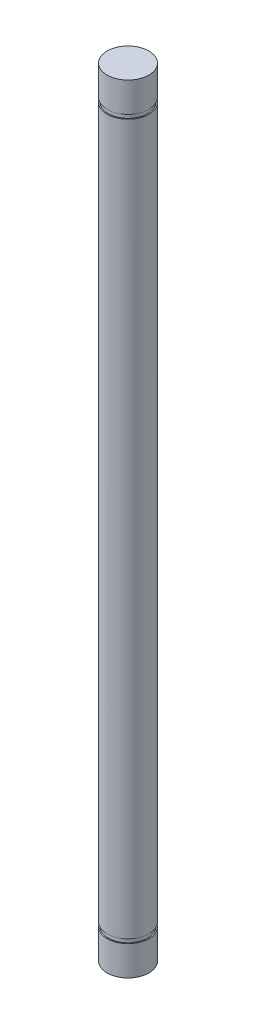
ISO-10303-21;
HEADER;
FILE_DESCRIPTION(('STEP AP214'),'2;1');
FILE_NAME('part.step','',(''),(''),'','','');
FILE_SCHEMA(('AUTOMOTIVE_DESIGN { 1 0 10303 214 1 1 1 1 }'));
ENDSEC;
DATA;
#1=APPLICATION_CONTEXT('core data for automotive mechanical design processes');
#2=APPLICATION_PROTOCOL_DEFINITION('international standard','automotive_design',2000,#1);
#3=PRODUCT_CONTEXT('',#1,'mechanical');
#4=PRODUCT('Part','Part','',(#3));
#5=PRODUCT_RELATED_PRODUCT_CATEGORY('part','',(#4));
#6=PRODUCT_DEFINITION_FORMATION('','',#4);
#7=PRODUCT_DEFINITION_CONTEXT('part definition',#1,'design');
#8=PRODUCT_DEFINITION('design','',#6,#7);
#9=PRODUCT_DEFINITION_SHAPE('','',#8);
#10=(LENGTH_UNIT() NAMED_UNIT(*) SI_UNIT(.MILLI.,.METRE.));
#11=(NAMED_UNIT(*) PLANE_ANGLE_UNIT() SI_UNIT($,.RADIAN.));
#12=(NAMED_UNIT(*) SI_UNIT($,.STERADIAN.) SOLID_ANGLE_UNIT());
#13=UNCERTAINTY_MEASURE_WITH_UNIT(LENGTH_MEASURE(1.E-05),#10,'distance_accuracy_value','');
#14=(GEOMETRIC_REPRESENTATION_CONTEXT(3) GLOBAL_UNCERTAINTY_ASSIGNED_CONTEXT((#13)) GLOBAL_UNIT_ASSIGNED_CONTEXT((#10,
#11,#12)) REPRESENTATION_CONTEXT('',''));
#15=CARTESIAN_POINT('',(0.,0.,0.));
#16=DIRECTION('',(0.,0.,1.));
#17=DIRECTION('',(1.,0.,0.));
#18=AXIS2_PLACEMENT_3D('',#15,#16,#17);
#19=CARTESIAN_POINT('',(0.,74.5,0.));
#20=DIRECTION('',(0.,-1.,0.));
#21=DIRECTION('',(0.,0.,-1.));
#22=AXIS2_PLACEMENT_3D('',#19,#20,#21);
#23=CYLINDRICAL_SURFACE('',#22,4.);
#24=CARTESIAN_POINT('',(0.,68.,0.));
#25=DIRECTION('',(0.,1.,0.));
#26=DIRECTION('',(0.,0.,1.));
#27=AXIS2_PLACEMENT_3D('',#24,#25,#26);
#28=CIRCLE('',#27,4.);
#29=CARTESIAN_POINT('',(0.,68.,4.));
#30=VERTEX_POINT('',#29);
#31=EDGE_CURVE('E54',#30,#30,#28,.T.);
#32=ORIENTED_EDGE('',*,*,#31,.F.);
#33=EDGE_LOOP('',(#32));
#34=FACE_BOUND('',#33,.T.);
#35=CARTESIAN_POINT('',(0.,-68.,0.));
#36=DIRECTION('',(0.,-1.,0.));
#37=DIRECTION('',(0.,0.,-1.));
#38=AXIS2_PLACEMENT_3D('',#35,#36,#37);
#39=CIRCLE('',#38,4.);
#40=CARTESIAN_POINT('',(0.,-68.,-4.));
#41=VERTEX_POINT('',#40);
#42=EDGE_CURVE('E58',#41,#41,#39,.T.);
#43=ORIENTED_EDGE('',*,*,#42,.F.);
#44=EDGE_LOOP('',(#43));
#45=FACE_BOUND('',#44,.T.);
#46=ADVANCED_FACE('F35',(#34,#45),#23,.T.);
#47=CARTESIAN_POINT('',(0.,74.5,0.));
#48=DIRECTION('',(0.,1.,0.));
#49=DIRECTION('',(0.,0.,1.));
#50=AXIS2_PLACEMENT_3D('',#47,#48,#49);
#51=CIRCLE('',#50,4.);
#52=CARTESIAN_POINT('',(0.,74.5,4.));
#53=VERTEX_POINT('',#52);
#54=EDGE_CURVE('E10',#53,#53,#51,.T.);
#55=ORIENTED_EDGE('',*,*,#54,.F.);
#56=EDGE_LOOP('',(#55));
#57=FACE_BOUND('',#56,.T.);
#58=CARTESIAN_POINT('',(0.,68.8,0.));
#59=DIRECTION('',(0.,-1.,0.));
#60=DIRECTION('',(0.,0.,-1.));
#61=AXIS2_PLACEMENT_3D('',#58,#59,#60);
#62=CIRCLE('',#61,4.);
#63=CARTESIAN_POINT('',(0.,68.8,-4.));
#64=VERTEX_POINT('',#63);
#65=EDGE_CURVE('E48',#64,#64,#62,.T.);
#66=ORIENTED_EDGE('',*,*,#65,.F.);
#67=EDGE_LOOP('',(#66));
#68=FACE_BOUND('',#67,.T.);
#69=ADVANCED_FACE('F37',(#57,#68),#23,.T.);
#70=CARTESIAN_POINT('',(0.,74.5,0.));
#71=DIRECTION('',(0.,1.,0.));
#72=DIRECTION('',(0.,0.,1.));
#73=AXIS2_PLACEMENT_3D('',#70,#71,#72);
#74=PLANE('',#73);
#75=ORIENTED_EDGE('',*,*,#54,.T.);
#76=EDGE_LOOP('',(#75));
#77=FACE_BOUND('',#76,.T.);
#78=ADVANCED_FACE('F102',(#77),#74,.T.);
#79=CARTESIAN_POINT('',(0.,68.8,-3.8));
#80=DIRECTION('',(0.,-1.,0.));
#81=DIRECTION('',(0.,0.,-1.));
#82=AXIS2_PLACEMENT_3D('',#79,#80,#81);
#83=PLANE('',#82);
#84=CARTESIAN_POINT('',(0.,68.8,0.));
#85=DIRECTION('',(0.,1.,0.));
#86=DIRECTION('',(0.,0.,1.));
#87=AXIS2_PLACEMENT_3D('',#84,#85,#86);
#88=CIRCLE('',#87,3.8);
#89=CARTESIAN_POINT('',(0.,68.8,3.8));
#90=VERTEX_POINT('',#89);
#91=EDGE_CURVE('E51',#90,#90,#88,.T.);
#92=ORIENTED_EDGE('',*,*,#91,.T.);
#93=EDGE_LOOP('',(#92));
#94=FACE_BOUND('',#93,.T.);
#95=ORIENTED_EDGE('',*,*,#65,.T.);
#96=EDGE_LOOP('',(#95));
#97=FACE_BOUND('',#96,.T.);
#98=ADVANCED_FACE('F78',(#94,#97),#83,.T.);
#99=CARTESIAN_POINT('',(0.,68.,-3.8));
#100=DIRECTION('',(0.,1.,0.));
#101=DIRECTION('',(0.,0.,1.));
#102=AXIS2_PLACEMENT_3D('',#99,#100,#101);
#103=PLANE('',#102);
#104=CARTESIAN_POINT('',(0.,68.,0.));
#105=DIRECTION('',(0.,1.,0.));
#106=DIRECTION('',(0.,0.,1.));
#107=AXIS2_PLACEMENT_3D('',#104,#105,#106);
#108=CIRCLE('',#107,3.8);
#109=CARTESIAN_POINT('',(0.,68.,3.8));
#110=VERTEX_POINT('',#109);
#111=EDGE_CURVE('E64',#110,#110,#108,.T.);
#112=ORIENTED_EDGE('',*,*,#111,.F.);
#113=EDGE_LOOP('',(#112));
#114=FACE_BOUND('',#113,.T.);
#115=ORIENTED_EDGE('',*,*,#31,.T.);
#116=EDGE_LOOP('',(#115));
#117=FACE_BOUND('',#116,.T.);
#118=ADVANCED_FACE('F84',(#114,#117),#103,.T.);
#119=CARTESIAN_POINT('',(0.,74.5,0.));
#120=DIRECTION('',(0.,1.,0.));
#121=DIRECTION('',(0.,0.,1.));
#122=AXIS2_PLACEMENT_3D('',#119,#120,#121);
#123=CYLINDRICAL_SURFACE('',#122,3.8);
#124=ORIENTED_EDGE('',*,*,#111,.T.);
#125=EDGE_LOOP('',(#124));
#126=FACE_BOUND('',#125,.T.);
#127=ORIENTED_EDGE('',*,*,#91,.F.);
#128=EDGE_LOOP('',(#127));
#129=FACE_BOUND('',#128,.T.);
#130=ADVANCED_FACE('F81',(#126,#129),#123,.T.);
#131=CARTESIAN_POINT('',(0.,-68.8,-3.8));
#132=DIRECTION('',(0.,1.,0.));
#133=DIRECTION('',(0.,0.,-1.));
#134=AXIS2_PLACEMENT_3D('',#131,#132,#133);
#135=PLANE('',#134);
#136=CARTESIAN_POINT('',(0.,-68.8,0.));
#137=DIRECTION('',(0.,1.,0.));
#138=DIRECTION('',(0.,0.,1.));
#139=AXIS2_PLACEMENT_3D('',#136,#137,#138);
#140=CIRCLE('',#139,3.8);
#141=CARTESIAN_POINT('',(0.,-68.8,3.8));
#142=VERTEX_POINT('',#141);
#143=EDGE_CURVE('E60',#142,#142,#140,.T.);
#144=ORIENTED_EDGE('',*,*,#143,.F.);
#145=EDGE_LOOP('',(#144));
#146=FACE_BOUND('',#145,.T.);
#147=CARTESIAN_POINT('',(0.,-68.8,0.));
#148=DIRECTION('',(0.,1.,0.));
#149=DIRECTION('',(0.,0.,1.));
#150=AXIS2_PLACEMENT_3D('',#147,#148,#149);
#151=CIRCLE('',#150,4.);
#152=CARTESIAN_POINT('',(0.,-68.8,4.));
#153=VERTEX_POINT('',#152);
#154=EDGE_CURVE('E39',#153,#153,#151,.T.);
#155=ORIENTED_EDGE('',*,*,#154,.T.);
#156=EDGE_LOOP('',(#155));
#157=FACE_BOUND('',#156,.T.);
#158=ADVANCED_FACE('F83',(#146,#157),#135,.T.);
#159=CARTESIAN_POINT('',(0.,-68.,-3.8));
#160=DIRECTION('',(0.,-1.,0.));
#161=DIRECTION('',(0.,0.,1.));
#162=AXIS2_PLACEMENT_3D('',#159,#160,#161);
#163=PLANE('',#162);
#164=CARTESIAN_POINT('',(0.,-68.,0.));
#165=DIRECTION('',(0.,1.,0.));
#166=DIRECTION('',(0.,0.,1.));
#167=AXIS2_PLACEMENT_3D('',#164,#165,#166);
#168=CIRCLE('',#167,3.8);
#169=CARTESIAN_POINT('',(0.,-68.,3.8));
#170=VERTEX_POINT('',#169);
#171=EDGE_CURVE('E66',#170,#170,#168,.T.);
#172=ORIENTED_EDGE('',*,*,#171,.T.);
#173=EDGE_LOOP('',(#172));
#174=FACE_BOUND('',#173,.T.);
#175=ORIENTED_EDGE('',*,*,#42,.T.);
#176=EDGE_LOOP('',(#175));
#177=FACE_BOUND('',#176,.T.);
#178=ADVANCED_FACE('F90',(#174,#177),#163,.T.);
#179=CARTESIAN_POINT('',(0.,-74.5,0.));
#180=DIRECTION('',(0.,-1.,0.));
#181=DIRECTION('',(0.,0.,1.));
#182=AXIS2_PLACEMENT_3D('',#179,#180,#181);
#183=CYLINDRICAL_SURFACE('',#182,3.8);
#184=ORIENTED_EDGE('',*,*,#171,.F.);
#185=EDGE_LOOP('',(#184));
#186=FACE_BOUND('',#185,.T.);
#187=ORIENTED_EDGE('',*,*,#143,.T.);
#188=EDGE_LOOP('',(#187));
#189=FACE_BOUND('',#188,.T.);
#190=ADVANCED_FACE('F112',(#186,#189),#183,.T.);
#191=CARTESIAN_POINT('',(0.,-74.5,0.));
#192=DIRECTION('',(0.,1.,0.));
#193=DIRECTION('',(0.,0.,1.));
#194=AXIS2_PLACEMENT_3D('',#191,#192,#193);
#195=PLANE('',#194);
#196=CARTESIAN_POINT('',(0.,-74.5,0.));
#197=DIRECTION('',(0.,1.,0.));
#198=DIRECTION('',(0.,0.,1.));
#199=AXIS2_PLACEMENT_3D('',#196,#197,#198);
#200=CIRCLE('',#199,4.);
#201=CARTESIAN_POINT('',(0.,-74.5,4.));
#202=VERTEX_POINT('',#201);
#203=EDGE_CURVE('E43',#202,#202,#200,.T.);
#204=ORIENTED_EDGE('',*,*,#203,.F.);
#205=EDGE_LOOP('',(#204));
#206=FACE_BOUND('',#205,.T.);
#207=ADVANCED_FACE('F107',(#206),#195,.F.);
#208=ORIENTED_EDGE('',*,*,#203,.T.);
#209=EDGE_LOOP('',(#208));
#210=FACE_BOUND('',#209,.T.);
#211=ORIENTED_EDGE('',*,*,#154,.F.);
#212=EDGE_LOOP('',(#211));
#213=FACE_BOUND('',#212,.T.);
#214=ADVANCED_FACE('F98',(#210,#213),#23,.T.);
#215=CLOSED_SHELL('',(#46,#69,#78,#98,#118,#130,#158,#178,#190,#207,#214));
#216=MANIFOLD_SOLID_BREP('B2',#215);
#217=ADVANCED_BREP_SHAPE_REPRESENTATION('',(#18,#216),#14);
#218=SHAPE_DEFINITION_REPRESENTATION(#9,#217);
ENDSEC;
END-ISO-10303-21;
